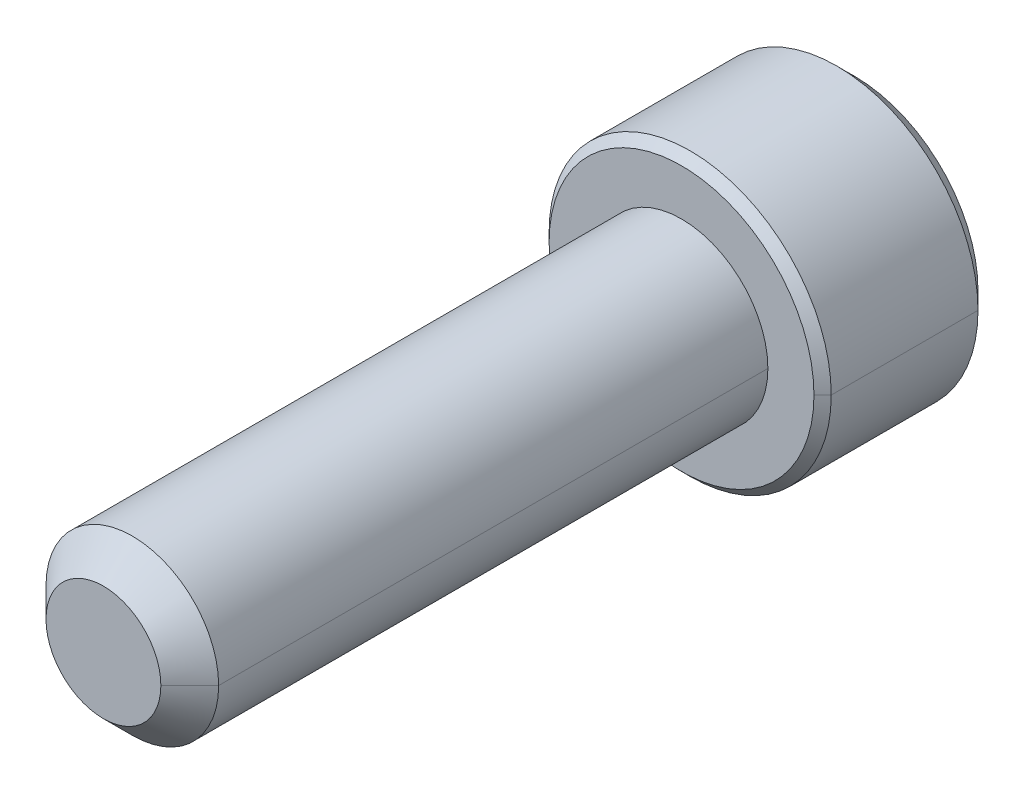
ISO-10303-21;
HEADER;
FILE_DESCRIPTION(('STEP AP214'),'2;1');
FILE_NAME('part.step','',(''),(''),'','','');
FILE_SCHEMA(('AUTOMOTIVE_DESIGN { 1 0 10303 214 1 1 1 1 }'));
ENDSEC;
DATA;
#1=APPLICATION_CONTEXT('core data for automotive mechanical design processes');
#2=APPLICATION_PROTOCOL_DEFINITION('international standard','automotive_design',2000,#1);
#3=PRODUCT_CONTEXT('',#1,'mechanical');
#4=PRODUCT('Part','Part','',(#3));
#5=PRODUCT_RELATED_PRODUCT_CATEGORY('part','',(#4));
#6=PRODUCT_DEFINITION_FORMATION('','',#4);
#7=PRODUCT_DEFINITION_CONTEXT('part definition',#1,'design');
#8=PRODUCT_DEFINITION('design','',#6,#7);
#9=PRODUCT_DEFINITION_SHAPE('','',#8);
#10=(LENGTH_UNIT() NAMED_UNIT(*) SI_UNIT(.MILLI.,.METRE.));
#11=(NAMED_UNIT(*) PLANE_ANGLE_UNIT() SI_UNIT($,.RADIAN.));
#12=(NAMED_UNIT(*) SI_UNIT($,.STERADIAN.) SOLID_ANGLE_UNIT());
#13=UNCERTAINTY_MEASURE_WITH_UNIT(LENGTH_MEASURE(1.E-05),#10,'distance_accuracy_value','');
#14=(GEOMETRIC_REPRESENTATION_CONTEXT(3) GLOBAL_UNCERTAINTY_ASSIGNED_CONTEXT((#13)) GLOBAL_UNIT_ASSIGNED_CONTEXT((#10,
#11,#12)) REPRESENTATION_CONTEXT('',''));
#15=CARTESIAN_POINT('',(0.,0.,0.));
#16=DIRECTION('',(0.,0.,1.));
#17=DIRECTION('',(1.,0.,0.));
#18=AXIS2_PLACEMENT_3D('',#15,#16,#17);
#19=CARTESIAN_POINT('',(0.,0.,-9.66724));
#20=DIRECTION('',(0.,0.,-1.));
#21=DIRECTION('',(-1.,0.,0.));
#22=AXIS2_PLACEMENT_3D('',#19,#20,#21);
#23=CONICAL_SURFACE('',#22,2.3241,0.785398163397447);
#24=CARTESIAN_POINT('',(0.,0.,-9.525));
#25=DIRECTION('',(0.,0.,1.));
#26=DIRECTION('',(-1.,0.,0.));
#27=AXIS2_PLACEMENT_3D('',#24,#25,#26);
#28=CIRCLE('',#27,2.18186);
#29=CARTESIAN_POINT('',(2.18186,0.,-9.525));
#30=VERTEX_POINT('',#29);
#31=CARTESIAN_POINT('',(-2.18186,0.,-9.525));
#32=VERTEX_POINT('',#31);
#33=EDGE_CURVE('E43',#30,#32,#28,.T.);
#34=ORIENTED_EDGE('',*,*,#33,.F.);
#35=DIRECTION('',(0.707106781186546,0.,-0.707106781186549));
#36=VECTOR('',#35,1.);
#37=CARTESIAN_POINT('',(2.3241,0.,-9.66724));
#38=LINE('',#37,#36);
#39=CARTESIAN_POINT('',(2.3241,0.,-9.66724));
#40=VERTEX_POINT('',#39);
#41=EDGE_CURVE('E11',#30,#40,#38,.T.);
#42=ORIENTED_EDGE('',*,*,#41,.T.);
#43=CARTESIAN_POINT('',(0.,0.,-9.66724));
#44=DIRECTION('',(0.,0.,-1.));
#45=DIRECTION('',(-1.,0.,0.));
#46=AXIS2_PLACEMENT_3D('',#43,#44,#45);
#47=CIRCLE('',#46,2.3241);
#48=CARTESIAN_POINT('',(-2.3241,0.,-9.66724));
#49=VERTEX_POINT('',#48);
#50=EDGE_CURVE('E554',#49,#40,#47,.T.);
#51=ORIENTED_EDGE('',*,*,#50,.F.);
#52=DIRECTION('',(-0.707106781186546,0.,-0.707106781186549));
#53=VECTOR('',#52,1.);
#54=CARTESIAN_POINT('',(-2.3241,0.,-9.66724));
#55=LINE('',#54,#53);
#56=EDGE_CURVE('E80',#32,#49,#55,.T.);
#57=ORIENTED_EDGE('',*,*,#56,.F.);
#58=EDGE_LOOP('',(#34,#42,#51,#57));
#59=FACE_BOUND('',#58,.T.);
#60=ADVANCED_FACE('F16',(#59),#23,.T.);
#61=CARTESIAN_POINT('',(0.,0.,-12.3698));
#62=DIRECTION('',(0.,0.,1.));
#63=DIRECTION('',(1.,0.,0.));
#64=AXIS2_PLACEMENT_3D('',#61,#62,#63);
#65=CONICAL_SURFACE('',#64,2.03962,0.785398163397448);
#66=CARTESIAN_POINT('',(0.,0.,-12.3698));
#67=DIRECTION('',(0.,0.,-1.));
#68=DIRECTION('',(-1.,0.,0.));
#69=AXIS2_PLACEMENT_3D('',#66,#67,#68);
#70=CIRCLE('',#69,2.03962);
#71=CARTESIAN_POINT('',(-2.03962,0.,-12.3698));
#72=VERTEX_POINT('',#71);
#73=CARTESIAN_POINT('',(2.03962,0.,-12.3698));
#74=VERTEX_POINT('',#73);
#75=EDGE_CURVE('E95',#72,#74,#70,.T.);
#76=ORIENTED_EDGE('',*,*,#75,.F.);
#77=DIRECTION('',(-0.707106781186547,0.,0.707106781186548));
#78=VECTOR('',#77,1.);
#79=CARTESIAN_POINT('',(-2.03962,0.,-12.3698));
#80=LINE('',#79,#78);
#81=CARTESIAN_POINT('',(-2.3241,0.,-12.08532));
#82=VERTEX_POINT('',#81);
#83=EDGE_CURVE('E29',#72,#82,#80,.T.);
#84=ORIENTED_EDGE('',*,*,#83,.T.);
#85=CARTESIAN_POINT('',(0.,0.,-12.08532));
#86=DIRECTION('',(0.,0.,1.));
#87=DIRECTION('',(-1.,0.,0.));
#88=AXIS2_PLACEMENT_3D('',#85,#86,#87);
#89=CIRCLE('',#88,2.3241);
#90=CARTESIAN_POINT('',(2.3241,0.,-12.08532));
#91=VERTEX_POINT('',#90);
#92=EDGE_CURVE('E197',#91,#82,#89,.T.);
#93=ORIENTED_EDGE('',*,*,#92,.F.);
#94=DIRECTION('',(0.707106781186547,0.,0.707106781186548));
#95=VECTOR('',#94,1.);
#96=CARTESIAN_POINT('',(2.03962,0.,-12.3698));
#97=LINE('',#96,#95);
#98=EDGE_CURVE('E570',#74,#91,#97,.T.);
#99=ORIENTED_EDGE('',*,*,#98,.F.);
#100=EDGE_LOOP('',(#76,#84,#93,#99));
#101=FACE_BOUND('',#100,.T.);
#102=ADVANCED_FACE('F413',(#101),#65,.T.);
#103=CARTESIAN_POINT('',(0.,0.,-12.3698));
#104=DIRECTION('',(0.,0.,-1.));
#105=DIRECTION('',(-1.,0.,0.));
#106=AXIS2_PLACEMENT_3D('',#103,#104,#105);
#107=CONICAL_SURFACE('',#106,1.3748153285078,0.78539816339745);
#108=CARTESIAN_POINT('',(-1.190625,0.,-12.1856096714922));
#109=CARTESIAN_POINT('',(-1.190625,0.172278178616055,-12.1856096714922));
#110=CARTESIAN_POINT('',(-1.190625,0.353926471092554,-12.2371005427235));
#111=CARTESIAN_POINT('',(-1.190625,0.511134708328644,-12.2816635220374));
#112=CARTESIAN_POINT('',(-1.190625,0.687407664253898,-12.3698));
#113=B_SPLINE_CURVE_WITH_KNOTS('',2,(#108,#109,#110,#111,#112),.UNSPECIFIED.,.F.,.F.,(3,2,3),
(0.,0.5,1.),.UNSPECIFIED.);
#114=CARTESIAN_POINT('',(-1.190625,0.,-12.1856096714922));
#115=VERTEX_POINT('',#114);
#116=CARTESIAN_POINT('',(-1.190625,0.687407664253898,-12.3698));
#117=VERTEX_POINT('',#116);
#118=EDGE_CURVE('E175',#115,#117,#113,.T.);
#119=ORIENTED_EDGE('',*,*,#118,.F.);
#120=DIRECTION('',(-0.707106781186549,0.,-0.707106781186546));
#121=VECTOR('',#120,1.);
#122=CARTESIAN_POINT('',(-1.3748153285078,0.,-12.3698));
#123=LINE('',#122,#121);
#124=CARTESIAN_POINT('',(-1.3748153285078,0.,-12.3698));
#125=VERTEX_POINT('',#124);
#126=EDGE_CURVE('E196',#115,#125,#123,.T.);
#127=ORIENTED_EDGE('',*,*,#126,.T.);
#128=CARTESIAN_POINT('',(0.,0.,-12.3698));
#129=DIRECTION('',(0.,0.,-1.));
#130=DIRECTION('',(-1.,0.,0.));
#131=AXIS2_PLACEMENT_3D('',#128,#129,#130);
#132=CIRCLE('',#131,1.3748153285078);
#133=EDGE_CURVE('E185',#125,#117,#132,.T.);
#134=ORIENTED_EDGE('',*,*,#133,.T.);
#135=EDGE_LOOP('',(#119,#127,#134));
#136=FACE_BOUND('',#135,.T.);
#137=ADVANCED_FACE('F199',(#136),#107,.F.);
#138=CARTESIAN_POINT('',(0.,0.,-12.3698));
#139=DIRECTION('',(0.,0.,1.));
#140=DIRECTION('',(1.,0.,0.));
#141=AXIS2_PLACEMENT_3D('',#138,#139,#140);
#142=CYLINDRICAL_SURFACE('',#141,2.3241);
#143=ORIENTED_EDGE('',*,*,#92,.T.);
#144=DIRECTION('',(0.,0.,1.));
#145=VECTOR('',#144,1.);
#146=CARTESIAN_POINT('',(-2.3241,0.,-12.3698));
#147=LINE('',#146,#145);
#148=EDGE_CURVE('E550',#82,#49,#147,.T.);
#149=ORIENTED_EDGE('',*,*,#148,.T.);
#150=ORIENTED_EDGE('',*,*,#50,.T.);
#151=DIRECTION('',(0.,0.,1.));
#152=VECTOR('',#151,1.);
#153=CARTESIAN_POINT('',(2.3241,0.,-12.3698));
#154=LINE('',#153,#152);
#155=EDGE_CURVE('E562',#91,#40,#154,.T.);
#156=ORIENTED_EDGE('',*,*,#155,.F.);
#157=EDGE_LOOP('',(#143,#149,#150,#156));
#158=FACE_BOUND('',#157,.T.);
#159=ADVANCED_FACE('F405',(#158),#142,.T.);
#160=CARTESIAN_POINT('',(0.,0.,0.));
#161=DIRECTION('',(0.,0.,-1.));
#162=DIRECTION('',(-1.,0.,0.));
#163=AXIS2_PLACEMENT_3D('',#160,#161,#162);
#164=CONICAL_SURFACE('',#163,0.94615,0.78539816339745);
#165=CARTESIAN_POINT('',(0.,0.,0.));
#166=DIRECTION('',(0.,0.,1.));
#167=DIRECTION('',(1.,0.,0.));
#168=AXIS2_PLACEMENT_3D('',#165,#166,#167);
#169=CIRCLE('',#168,0.94615);
#170=CARTESIAN_POINT('',(0.94615,0.,0.));
#171=VERTEX_POINT('',#170);
#172=CARTESIAN_POINT('',(-0.94615,0.,0.));
#173=VERTEX_POINT('',#172);
#174=EDGE_CURVE('E142',#171,#173,#169,.T.);
#175=ORIENTED_EDGE('',*,*,#174,.F.);
#176=DIRECTION('',(0.707106781186549,0.,-0.707106781186546));
#177=VECTOR('',#176,1.);
#178=CARTESIAN_POINT('',(0.94615,0.,0.));
#179=LINE('',#178,#177);
#180=CARTESIAN_POINT('',(1.4224,0.,-0.47625));
#181=VERTEX_POINT('',#180);
#182=EDGE_CURVE('E605',#171,#181,#179,.T.);
#183=ORIENTED_EDGE('',*,*,#182,.T.);
#184=CARTESIAN_POINT('',(0.,0.,-0.47625));
#185=DIRECTION('',(0.,0.,-1.));
#186=DIRECTION('',(1.,0.,0.));
#187=AXIS2_PLACEMENT_3D('',#184,#185,#186);
#188=CIRCLE('',#187,1.4224);
#189=CARTESIAN_POINT('',(-1.4224,0.,-0.47625));
#190=VERTEX_POINT('',#189);
#191=EDGE_CURVE('E597',#190,#181,#188,.T.);
#192=ORIENTED_EDGE('',*,*,#191,.F.);
#193=DIRECTION('',(-0.707106781186549,0.,-0.707106781186546));
#194=VECTOR('',#193,1.);
#195=CARTESIAN_POINT('',(-0.94615,0.,0.));
#196=LINE('',#195,#194);
#197=EDGE_CURVE('E555',#173,#190,#196,.T.);
#198=ORIENTED_EDGE('',*,*,#197,.F.);
#199=EDGE_LOOP('',(#175,#183,#192,#198));
#200=FACE_BOUND('',#199,.T.);
#201=ADVANCED_FACE('F403',(#200),#164,.T.);
#202=CARTESIAN_POINT('',(0.,0.,-9.525));
#203=DIRECTION('',(0.,0.,1.));
#204=DIRECTION('',(1.,0.,0.));
#205=AXIS2_PLACEMENT_3D('',#202,#203,#204);
#206=CYLINDRICAL_SURFACE('',#205,1.4224);
#207=CARTESIAN_POINT('',(0.,0.,-9.525));
#208=DIRECTION('',(0.,0.,1.));
#209=DIRECTION('',(-1.,0.,0.));
#210=AXIS2_PLACEMENT_3D('',#207,#208,#209);
#211=CIRCLE('',#210,1.4224);
#212=CARTESIAN_POINT('',(1.4224,0.,-9.525));
#213=VERTEX_POINT('',#212);
#214=CARTESIAN_POINT('',(-1.4224,0.,-9.525));
#215=VERTEX_POINT('',#214);
#216=EDGE_CURVE('E602',#213,#215,#211,.T.);
#217=ORIENTED_EDGE('',*,*,#216,.T.);
#218=DIRECTION('',(0.,0.,1.));
#219=VECTOR('',#218,1.);
#220=CARTESIAN_POINT('',(-1.4224,0.,-9.525));
#221=LINE('',#220,#219);
#222=EDGE_CURVE('E594',#215,#190,#221,.T.);
#223=ORIENTED_EDGE('',*,*,#222,.T.);
#224=ORIENTED_EDGE('',*,*,#191,.T.);
#225=DIRECTION('',(0.,0.,1.));
#226=VECTOR('',#225,1.);
#227=CARTESIAN_POINT('',(1.4224,0.,-9.525));
#228=LINE('',#227,#226);
#229=EDGE_CURVE('E155',#213,#181,#228,.T.);
#230=ORIENTED_EDGE('',*,*,#229,.F.);
#231=EDGE_LOOP('',(#217,#223,#224,#230));
#232=FACE_BOUND('',#231,.T.);
#233=ADVANCED_FACE('F316',(#232),#206,.T.);
#234=CARTESIAN_POINT('',(0.,0.,-9.525));
#235=DIRECTION('',(0.,0.,1.));
#236=DIRECTION('',(1.,0.,0.));
#237=AXIS2_PLACEMENT_3D('',#234,#235,#236);
#238=CYLINDRICAL_SURFACE('',#237,1.4224);
#239=ORIENTED_EDGE('',*,*,#222,.F.);
#240=CARTESIAN_POINT('',(0.,0.,-9.525));
#241=DIRECTION('',(0.,0.,1.));
#242=DIRECTION('',(-1.,0.,0.));
#243=AXIS2_PLACEMENT_3D('',#240,#241,#242);
#244=CIRCLE('',#243,1.4224);
#245=EDGE_CURVE('E584',#215,#213,#244,.T.);
#246=ORIENTED_EDGE('',*,*,#245,.T.);
#247=ORIENTED_EDGE('',*,*,#229,.T.);
#248=CARTESIAN_POINT('',(0.,0.,-0.47625));
#249=DIRECTION('',(0.,0.,-1.));
#250=DIRECTION('',(1.,0.,0.));
#251=AXIS2_PLACEMENT_3D('',#248,#249,#250);
#252=CIRCLE('',#251,1.4224);
#253=EDGE_CURVE('E577',#181,#190,#252,.T.);
#254=ORIENTED_EDGE('',*,*,#253,.T.);
#255=EDGE_LOOP('',(#239,#246,#247,#254));
#256=FACE_BOUND('',#255,.T.);
#257=ADVANCED_FACE('F307',(#256),#238,.T.);
#258=CARTESIAN_POINT('',(0.,0.,0.));
#259=DIRECTION('',(0.,0.,1.));
#260=DIRECTION('',(1.,0.,0.));
#261=AXIS2_PLACEMENT_3D('',#258,#259,#260);
#262=PLANE('',#261);
#263=CARTESIAN_POINT('',(0.,0.,0.));
#264=DIRECTION('',(0.,0.,1.));
#265=DIRECTION('',(1.,0.,0.));
#266=AXIS2_PLACEMENT_3D('',#263,#264,#265);
#267=CIRCLE('',#266,0.94615);
#268=EDGE_CURVE('E576',#173,#171,#267,.T.);
#269=ORIENTED_EDGE('',*,*,#268,.T.);
#270=ORIENTED_EDGE('',*,*,#174,.T.);
#271=EDGE_LOOP('',(#269,#270));
#272=FACE_BOUND('',#271,.T.);
#273=ADVANCED_FACE('F303',(#272),#262,.T.);
#274=CARTESIAN_POINT('',(0.,0.,0.));
#275=DIRECTION('',(0.,0.,-1.));
#276=DIRECTION('',(-1.,0.,0.));
#277=AXIS2_PLACEMENT_3D('',#274,#275,#276);
#278=CONICAL_SURFACE('',#277,0.94615,0.78539816339745);
#279=ORIENTED_EDGE('',*,*,#182,.F.);
#280=ORIENTED_EDGE('',*,*,#268,.F.);
#281=ORIENTED_EDGE('',*,*,#197,.T.);
#282=ORIENTED_EDGE('',*,*,#253,.F.);
#283=EDGE_LOOP('',(#279,#280,#281,#282));
#284=FACE_BOUND('',#283,.T.);
#285=ADVANCED_FACE('F306',(#284),#278,.T.);
#286=CARTESIAN_POINT('',(0.,0.,-12.3698));
#287=DIRECTION('',(0.,0.,1.));
#288=DIRECTION('',(1.,0.,0.));
#289=AXIS2_PLACEMENT_3D('',#286,#287,#288);
#290=CYLINDRICAL_SURFACE('',#289,2.3241);
#291=ORIENTED_EDGE('',*,*,#148,.F.);
#292=CARTESIAN_POINT('',(0.,0.,-12.08532));
#293=DIRECTION('',(0.,0.,1.));
#294=DIRECTION('',(-1.,0.,0.));
#295=AXIS2_PLACEMENT_3D('',#292,#293,#294);
#296=CIRCLE('',#295,2.3241);
#297=EDGE_CURVE('E558',#82,#91,#296,.T.);
#298=ORIENTED_EDGE('',*,*,#297,.T.);
#299=ORIENTED_EDGE('',*,*,#155,.T.);
#300=CARTESIAN_POINT('',(0.,0.,-9.66724));
#301=DIRECTION('',(0.,0.,-1.));
#302=DIRECTION('',(-1.,0.,0.));
#303=AXIS2_PLACEMENT_3D('',#300,#301,#302);
#304=CIRCLE('',#303,2.3241);
#305=EDGE_CURVE('E548',#40,#49,#304,.T.);
#306=ORIENTED_EDGE('',*,*,#305,.T.);
#307=EDGE_LOOP('',(#291,#298,#299,#306));
#308=FACE_BOUND('',#307,.T.);
#309=ADVANCED_FACE('F312',(#308),#290,.T.);
#310=CARTESIAN_POINT('',(0.,0.,-12.3698));
#311=DIRECTION('',(0.,0.,-1.));
#312=DIRECTION('',(0.,-1.,0.));
#313=AXIS2_PLACEMENT_3D('',#310,#311,#312);
#314=PLANE('',#313);
#315=CARTESIAN_POINT('',(0.,0.,-12.3698));
#316=DIRECTION('',(0.,0.,-1.));
#317=DIRECTION('',(-1.,0.,0.));
#318=AXIS2_PLACEMENT_3D('',#315,#316,#317);
#319=CIRCLE('',#318,2.03962);
#320=EDGE_CURVE('E571',#74,#72,#319,.T.);
#321=ORIENTED_EDGE('',*,*,#320,.T.);
#322=ORIENTED_EDGE('',*,*,#75,.T.);
#323=EDGE_LOOP('',(#321,#322));
#324=FACE_BOUND('',#323,.T.);
#325=CARTESIAN_POINT('',(0.,0.,-12.3698));
#326=DIRECTION('',(0.,0.,-1.));
#327=DIRECTION('',(-1.,0.,0.));
#328=AXIS2_PLACEMENT_3D('',#325,#326,#327);
#329=CIRCLE('',#328,1.3748153285078);
#330=CARTESIAN_POINT('',(0.,1.3748153285078,-12.3698));
#331=VERTEX_POINT('',#330);
#332=EDGE_CURVE('E193',#117,#331,#329,.T.);
#333=ORIENTED_EDGE('',*,*,#332,.F.);
#334=ORIENTED_EDGE('',*,*,#133,.F.);
#335=CARTESIAN_POINT('',(0.,0.,-12.3698));
#336=DIRECTION('',(0.,0.,-1.));
#337=DIRECTION('',(-1.,0.,0.));
#338=AXIS2_PLACEMENT_3D('',#335,#336,#337);
#339=CIRCLE('',#338,1.3748153285078);
#340=CARTESIAN_POINT('',(-1.190625,-0.687407664253898,-12.3698));
#341=VERTEX_POINT('',#340);
#342=EDGE_CURVE('E189',#341,#125,#339,.T.);
#343=ORIENTED_EDGE('',*,*,#342,.F.);
#344=CARTESIAN_POINT('',(0.,0.,-12.3698));
#345=DIRECTION('',(0.,0.,-1.));
#346=DIRECTION('',(-1.,0.,0.));
#347=AXIS2_PLACEMENT_3D('',#344,#345,#346);
#348=CIRCLE('',#347,1.3748153285078);
#349=CARTESIAN_POINT('',(0.,-1.3748153285078,-12.3698));
#350=VERTEX_POINT('',#349);
#351=EDGE_CURVE('E209',#350,#341,#348,.T.);
#352=ORIENTED_EDGE('',*,*,#351,.F.);
#353=CARTESIAN_POINT('',(0.,0.,-12.3698));
#354=DIRECTION('',(0.,0.,-1.));
#355=DIRECTION('',(-1.,0.,0.));
#356=AXIS2_PLACEMENT_3D('',#353,#354,#355);
#357=CIRCLE('',#356,1.3748153285078);
#358=CARTESIAN_POINT('',(1.190625,-0.687407664253898,-12.3698));
#359=VERTEX_POINT('',#358);
#360=EDGE_CURVE('E216',#359,#350,#357,.T.);
#361=ORIENTED_EDGE('',*,*,#360,.F.);
#362=CARTESIAN_POINT('',(0.,0.,-12.3698));
#363=DIRECTION('',(0.,0.,-1.));
#364=DIRECTION('',(-1.,0.,0.));
#365=AXIS2_PLACEMENT_3D('',#362,#363,#364);
#366=CIRCLE('',#365,1.3748153285078);
#367=CARTESIAN_POINT('',(1.190625,0.687407664253899,-12.3698));
#368=VERTEX_POINT('',#367);
#369=EDGE_CURVE('E471',#368,#359,#366,.T.);
#370=ORIENTED_EDGE('',*,*,#369,.F.);
#371=CARTESIAN_POINT('',(0.,0.,-12.3698));
#372=DIRECTION('',(0.,0.,-1.));
#373=DIRECTION('',(-1.,0.,0.));
#374=AXIS2_PLACEMENT_3D('',#371,#372,#373);
#375=CIRCLE('',#374,1.3748153285078);
#376=EDGE_CURVE('E468',#331,#368,#375,.T.);
#377=ORIENTED_EDGE('',*,*,#376,.F.);
#378=EDGE_LOOP('',(#333,#334,#343,#352,#361,#370,#377));
#379=FACE_BOUND('',#378,.T.);
#380=ADVANCED_FACE('F186',(#324,#379),#314,.T.);
#381=CARTESIAN_POINT('',(0.,0.,-9.525));
#382=DIRECTION('',(0.,0.,-1.));
#383=DIRECTION('',(0.,-1.,0.));
#384=AXIS2_PLACEMENT_3D('',#381,#382,#383);
#385=PLANE('',#384);
#386=CARTESIAN_POINT('',(0.,0.,-9.525));
#387=DIRECTION('',(0.,0.,1.));
#388=DIRECTION('',(-1.,0.,0.));
#389=AXIS2_PLACEMENT_3D('',#386,#387,#388);
#390=CIRCLE('',#389,2.18186);
#391=EDGE_CURVE('E563',#32,#30,#390,.T.);
#392=ORIENTED_EDGE('',*,*,#391,.T.);
#393=ORIENTED_EDGE('',*,*,#33,.T.);
#394=EDGE_LOOP('',(#392,#393));
#395=FACE_BOUND('',#394,.T.);
#396=ORIENTED_EDGE('',*,*,#216,.F.);
#397=ORIENTED_EDGE('',*,*,#245,.F.);
#398=EDGE_LOOP('',(#396,#397));
#399=FACE_BOUND('',#398,.T.);
#400=ADVANCED_FACE('F311',(#395,#399),#385,.F.);
#401=CARTESIAN_POINT('',(0.,0.,-12.3698));
#402=DIRECTION('',(0.,0.,-1.));
#403=DIRECTION('',(-1.,0.,0.));
#404=AXIS2_PLACEMENT_3D('',#401,#402,#403);
#405=CONICAL_SURFACE('',#404,1.3748153285078,0.78539816339745);
#406=ORIENTED_EDGE('',*,*,#376,.T.);
#407=CARTESIAN_POINT('',(0.,1.3748153285078,-12.3698));
#408=CARTESIAN_POINT('',(0.317600885196483,1.19144837194474,-12.1864330434369));
#409=CARTESIAN_POINT('',(0.593119038485548,1.03237789197667,-12.1856123654655));
#410=CARTESIAN_POINT('',(0.870173277928649,0.872420552254072,-12.1847871119985));
#411=CARTESIAN_POINT('',(1.190625,0.687407664253898,-12.3698));
#412=B_SPLINE_CURVE_WITH_KNOTS('',2,(#407,#408,#409,#410,#411),.UNSPECIFIED.,.F.,.F.,(3,2,3),
(0.,0.5,1.),.UNSPECIFIED.);
#413=EDGE_CURVE('E457',#331,#368,#412,.T.);
#414=ORIENTED_EDGE('',*,*,#413,.F.);
#415=EDGE_LOOP('',(#406,#414));
#416=FACE_BOUND('',#415,.T.);
#417=ADVANCED_FACE('F253',(#416),#405,.F.);
#418=CARTESIAN_POINT('',(0.,0.,-12.3698));
#419=DIRECTION('',(0.,0.,-1.));
#420=DIRECTION('',(-1.,0.,0.));
#421=AXIS2_PLACEMENT_3D('',#418,#419,#420);
#422=CONICAL_SURFACE('',#421,1.3748153285078,0.78539816339745);
#423=ORIENTED_EDGE('',*,*,#369,.T.);
#424=CARTESIAN_POINT('',(1.190625,0.687407664253898,-12.3698));
#425=CARTESIAN_POINT('',(1.190625,0.319414746746739,-12.1858035412464));
#426=CARTESIAN_POINT('',(1.190625,0.000186367613154762,-12.1856096860782));
#427=CARTESIAN_POINT('',(1.190625,-0.318639814551512,-12.1854160751488));
#428=CARTESIAN_POINT('',(1.190625,-0.687407664253898,-12.3698));
#429=B_SPLINE_CURVE_WITH_KNOTS('',2,(#424,#425,#426,#427,#428),.UNSPECIFIED.,.F.,.F.,(3,2,3),
(0.,0.5,1.),.UNSPECIFIED.);
#430=EDGE_CURVE('E341',#368,#359,#429,.T.);
#431=ORIENTED_EDGE('',*,*,#430,.F.);
#432=EDGE_LOOP('',(#423,#431));
#433=FACE_BOUND('',#432,.T.);
#434=ADVANCED_FACE('F348',(#433),#422,.F.);
#435=CARTESIAN_POINT('',(0.,0.,-12.3698));
#436=DIRECTION('',(0.,0.,-1.));
#437=DIRECTION('',(-1.,0.,0.));
#438=AXIS2_PLACEMENT_3D('',#435,#436,#437);
#439=CONICAL_SURFACE('',#438,1.3748153285078,0.78539816339745);
#440=ORIENTED_EDGE('',*,*,#360,.T.);
#441=CARTESIAN_POINT('',(1.190625,-0.687407664253898,-12.3698));
#442=CARTESIAN_POINT('',(0.873024114801661,-0.870774620818022,-12.1864330434359));
#443=CARTESIAN_POINT('',(0.597505961514452,-1.02984510078502,-12.1856123654655));
#444=CARTESIAN_POINT('',(0.320451722069476,-1.18980244050871,-12.1847871119996));
#445=CARTESIAN_POINT('',(0.,-1.3748153285078,-12.3698));
#446=B_SPLINE_CURVE_WITH_KNOTS('',2,(#441,#442,#443,#444,#445),.UNSPECIFIED.,.F.,.F.,(3,2,3),
(0.,0.5,1.),.UNSPECIFIED.);
#447=EDGE_CURVE('E379',#359,#350,#446,.T.);
#448=ORIENTED_EDGE('',*,*,#447,.F.);
#449=EDGE_LOOP('',(#440,#448));
#450=FACE_BOUND('',#449,.T.);
#451=ADVANCED_FACE('F357',(#450),#439,.F.);
#452=CARTESIAN_POINT('',(0.,0.,-12.3698));
#453=DIRECTION('',(0.,0.,-1.));
#454=DIRECTION('',(-1.,0.,0.));
#455=AXIS2_PLACEMENT_3D('',#452,#453,#454);
#456=CONICAL_SURFACE('',#455,1.3748153285078,0.78539816339745);
#457=ORIENTED_EDGE('',*,*,#351,.T.);
#458=CARTESIAN_POINT('',(0.,-1.3748153285078,-12.3698));
#459=CARTESIAN_POINT('',(-0.317600885197414,-1.19144837194421,-12.1864330434364));
#460=CARTESIAN_POINT('',(-0.593119038485548,-1.03237789197667,-12.1856123654655));
#461=CARTESIAN_POINT('',(-0.870173277929577,-0.872420552253536,-12.1847871119991));
#462=CARTESIAN_POINT('',(-1.190625,-0.687407664253898,-12.3698));
#463=B_SPLINE_CURVE_WITH_KNOTS('',2,(#458,#459,#460,#461,#462),.UNSPECIFIED.,.F.,.F.,(3,2,3),
(0.,0.5,1.),.UNSPECIFIED.);
#464=EDGE_CURVE('E232',#350,#341,#463,.T.);
#465=ORIENTED_EDGE('',*,*,#464,.F.);
#466=EDGE_LOOP('',(#457,#465));
#467=FACE_BOUND('',#466,.T.);
#468=ADVANCED_FACE('F301',(#467),#456,.F.);
#469=CARTESIAN_POINT('',(0.,0.,-12.3698));
#470=DIRECTION('',(0.,0.,-1.));
#471=DIRECTION('',(-1.,0.,0.));
#472=AXIS2_PLACEMENT_3D('',#469,#470,#471);
#473=CONICAL_SURFACE('',#472,1.3748153285078,0.78539816339745);
#474=ORIENTED_EDGE('',*,*,#126,.F.);
#475=CARTESIAN_POINT('',(-1.190625,-0.687407664253898,-12.3698));
#476=CARTESIAN_POINT('',(-1.190625,-0.319027007238298,-12.1856096714922));
#477=CARTESIAN_POINT('',(-1.190625,0.,-12.1856096714922));
#478=B_SPLINE_CURVE_WITH_KNOTS('',2,(#475,#476,#477),.UNSPECIFIED.,.F.,.F.,(3,3),(0.,1.),.UNSPECIFIED.);
#479=EDGE_CURVE('E205',#341,#115,#478,.T.);
#480=ORIENTED_EDGE('',*,*,#479,.F.);
#481=ORIENTED_EDGE('',*,*,#342,.T.);
#482=EDGE_LOOP('',(#474,#480,#481));
#483=FACE_BOUND('',#482,.T.);
#484=ADVANCED_FACE('F204',(#483),#473,.F.);
#485=CARTESIAN_POINT('',(0.,0.,-12.3698));
#486=DIRECTION('',(0.,0.,-1.));
#487=DIRECTION('',(-1.,0.,0.));
#488=AXIS2_PLACEMENT_3D('',#485,#486,#487);
#489=CONICAL_SURFACE('',#488,1.3748153285078,0.78539816339745);
#490=ORIENTED_EDGE('',*,*,#332,.T.);
#491=CARTESIAN_POINT('',(-1.190625,0.687407664253898,-12.3698));
#492=CARTESIAN_POINT('',(-0.873024114801661,0.870774620818022,-12.1864330434359));
#493=CARTESIAN_POINT('',(-0.597505961514452,1.02984510078502,-12.1856123654655));
#494=CARTESIAN_POINT('',(-0.320451722069476,1.18980244050871,-12.1847871119996));
#495=CARTESIAN_POINT('',(0.,1.3748153285078,-12.3698));
#496=B_SPLINE_CURVE_WITH_KNOTS('',2,(#491,#492,#493,#494,#495),.UNSPECIFIED.,.F.,.F.,(3,2,3),
(0.,0.5,1.),.UNSPECIFIED.);
#497=EDGE_CURVE('E282',#117,#331,#496,.T.);
#498=ORIENTED_EDGE('',*,*,#497,.F.);
#499=EDGE_LOOP('',(#490,#498));
#500=FACE_BOUND('',#499,.T.);
#501=ADVANCED_FACE('F422',(#500),#489,.F.);
#502=CARTESIAN_POINT('',(1.190625,2.0622229927617,-10.5838625));
#503=DIRECTION('',(0.,0.,-1.));
#504=DIRECTION('',(0.,-1.,0.));
#505=AXIS2_PLACEMENT_3D('',#502,#503,#504);
#506=PLANE('',#505);
#507=DIRECTION('',(0.866025403784439,0.5,0.));
#508=VECTOR('',#507,1.);
#509=CARTESIAN_POINT('',(-1.190625,0.687407664253898,-10.5838625));
#510=LINE('',#509,#508);
#511=CARTESIAN_POINT('',(-1.190625,0.687407664253898,-10.5838625));
#512=VERTEX_POINT('',#511);
#513=CARTESIAN_POINT('',(0.,1.3748153285078,-10.5838625));
#514=VERTEX_POINT('',#513);
#515=EDGE_CURVE('E219',#512,#514,#510,.T.);
#516=ORIENTED_EDGE('',*,*,#515,.T.);
#517=DIRECTION('',(0.866025403784439,-0.5,0.));
#518=VECTOR('',#517,1.);
#519=CARTESIAN_POINT('',(0.,1.3748153285078,-10.5838625));
#520=LINE('',#519,#518);
#521=CARTESIAN_POINT('',(1.190625,0.687407664253898,-10.5838625));
#522=VERTEX_POINT('',#521);
#523=EDGE_CURVE('E544',#514,#522,#520,.T.);
#524=ORIENTED_EDGE('',*,*,#523,.T.);
#525=DIRECTION('',(0.,-1.,0.));
#526=VECTOR('',#525,1.);
#527=CARTESIAN_POINT('',(1.190625,0.687407664253898,-10.5838625));
#528=LINE('',#527,#526);
#529=CARTESIAN_POINT('',(1.190625,-0.687407664253898,-10.5838625));
#530=VERTEX_POINT('',#529);
#531=EDGE_CURVE('E538',#522,#530,#528,.T.);
#532=ORIENTED_EDGE('',*,*,#531,.T.);
#533=DIRECTION('',(-0.866025403784439,-0.5,0.));
#534=VECTOR('',#533,1.);
#535=CARTESIAN_POINT('',(1.190625,-0.687407664253898,-10.5838625));
#536=LINE('',#535,#534);
#537=CARTESIAN_POINT('',(0.,-1.3748153285078,-10.5838625));
#538=VERTEX_POINT('',#537);
#539=EDGE_CURVE('E533',#530,#538,#536,.T.);
#540=ORIENTED_EDGE('',*,*,#539,.T.);
#541=DIRECTION('',(-0.866025403784439,0.5,0.));
#542=VECTOR('',#541,1.);
#543=CARTESIAN_POINT('',(0.,-1.3748153285078,-10.5838625));
#544=LINE('',#543,#542);
#545=CARTESIAN_POINT('',(-1.190625,-0.687407664253898,-10.5838625));
#546=VERTEX_POINT('',#545);
#547=EDGE_CURVE('E530',#538,#546,#544,.T.);
#548=ORIENTED_EDGE('',*,*,#547,.T.);
#549=DIRECTION('',(0.,1.,0.));
#550=VECTOR('',#549,1.);
#551=CARTESIAN_POINT('',(-1.190625,-0.687407664253898,-10.5838625));
#552=LINE('',#551,#550);
#553=EDGE_CURVE('E478',#546,#512,#552,.T.);
#554=ORIENTED_EDGE('',*,*,#553,.T.);
#555=EDGE_LOOP('',(#516,#524,#532,#540,#548,#554));
#556=FACE_BOUND('',#555,.T.);
#557=ADVANCED_FACE('F421',(#556),#506,.T.);
#558=CARTESIAN_POINT('',(0.,1.3748153285078,-10.5838625));
#559=DIRECTION('',(0.5,0.866025403784439,0.));
#560=DIRECTION('',(0.,0.,-1.));
#561=AXIS2_PLACEMENT_3D('',#558,#559,#560);
#562=PLANE('',#561);
#563=DIRECTION('',(0.,0.,-1.));
#564=VECTOR('',#563,1.);
#565=CARTESIAN_POINT('',(0.,1.3748153285078,-10.5838625));
#566=LINE('',#565,#564);
#567=EDGE_CURVE('E474',#514,#331,#566,.T.);
#568=ORIENTED_EDGE('',*,*,#567,.T.);
#569=ORIENTED_EDGE('',*,*,#413,.T.);
#570=DIRECTION('',(0.,0.,-1.));
#571=VECTOR('',#570,1.);
#572=CARTESIAN_POINT('',(1.190625,0.687407664253898,-10.5838625));
#573=LINE('',#572,#571);
#574=EDGE_CURVE('E485',#522,#368,#573,.T.);
#575=ORIENTED_EDGE('',*,*,#574,.F.);
#576=ORIENTED_EDGE('',*,*,#523,.F.);
#577=EDGE_LOOP('',(#568,#569,#575,#576));
#578=FACE_BOUND('',#577,.T.);
#579=ADVANCED_FACE('F322',(#578),#562,.F.);
#580=CARTESIAN_POINT('',(1.190625,0.687407664253898,-10.5838625));
#581=DIRECTION('',(1.,0.,0.));
#582=DIRECTION('',(0.,1.,0.));
#583=AXIS2_PLACEMENT_3D('',#580,#581,#582);
#584=PLANE('',#583);
#585=ORIENTED_EDGE('',*,*,#574,.T.);
#586=ORIENTED_EDGE('',*,*,#430,.T.);
#587=DIRECTION('',(0.,0.,-1.));
#588=VECTOR('',#587,1.);
#589=CARTESIAN_POINT('',(1.190625,-0.687407664253898,-10.5838625));
#590=LINE('',#589,#588);
#591=EDGE_CURVE('E496',#530,#359,#590,.T.);
#592=ORIENTED_EDGE('',*,*,#591,.F.);
#593=ORIENTED_EDGE('',*,*,#531,.F.);
#594=EDGE_LOOP('',(#585,#586,#592,#593));
#595=FACE_BOUND('',#594,.T.);
#596=ADVANCED_FACE('F317',(#595),#584,.F.);
#597=CARTESIAN_POINT('',(1.190625,-0.687407664253898,-10.5838625));
#598=DIRECTION('',(0.5,-0.866025403784439,0.));
#599=DIRECTION('',(0.,0.,-1.));
#600=AXIS2_PLACEMENT_3D('',#597,#598,#599);
#601=PLANE('',#600);
#602=ORIENTED_EDGE('',*,*,#591,.T.);
#603=ORIENTED_EDGE('',*,*,#447,.T.);
#604=DIRECTION('',(0.,0.,-1.));
#605=VECTOR('',#604,1.);
#606=CARTESIAN_POINT('',(0.,-1.3748153285078,-10.5838625));
#607=LINE('',#606,#605);
#608=EDGE_CURVE('E375',#538,#350,#607,.T.);
#609=ORIENTED_EDGE('',*,*,#608,.F.);
#610=ORIENTED_EDGE('',*,*,#539,.F.);
#611=EDGE_LOOP('',(#602,#603,#609,#610));
#612=FACE_BOUND('',#611,.T.);
#613=ADVANCED_FACE('F321',(#612),#601,.F.);
#614=CARTESIAN_POINT('',(0.,-1.3748153285078,-10.5838625));
#615=DIRECTION('',(-0.5,-0.866025403784439,0.));
#616=DIRECTION('',(-0.866025403784439,0.5,0.));
#617=AXIS2_PLACEMENT_3D('',#614,#615,#616);
#618=PLANE('',#617);
#619=ORIENTED_EDGE('',*,*,#608,.T.);
#620=ORIENTED_EDGE('',*,*,#464,.T.);
#621=DIRECTION('',(0.,0.,-1.));
#622=VECTOR('',#621,1.);
#623=CARTESIAN_POINT('',(-1.190625,-0.687407664253898,-10.5838625));
#624=LINE('',#623,#622);
#625=EDGE_CURVE('E229',#546,#341,#624,.T.);
#626=ORIENTED_EDGE('',*,*,#625,.F.);
#627=ORIENTED_EDGE('',*,*,#547,.F.);
#628=EDGE_LOOP('',(#619,#620,#626,#627));
#629=FACE_BOUND('',#628,.T.);
#630=ADVANCED_FACE('F252',(#629),#618,.F.);
#631=CARTESIAN_POINT('',(-1.190625,-0.687407664253898,-10.5838625));
#632=DIRECTION('',(-1.,0.,0.));
#633=DIRECTION('',(0.,0.,1.));
#634=AXIS2_PLACEMENT_3D('',#631,#632,#633);
#635=PLANE('',#634);
#636=ORIENTED_EDGE('',*,*,#625,.T.);
#637=ORIENTED_EDGE('',*,*,#479,.T.);
#638=ORIENTED_EDGE('',*,*,#118,.T.);
#639=DIRECTION('',(0.,0.,-1.));
#640=VECTOR('',#639,1.);
#641=CARTESIAN_POINT('',(-1.190625,0.687407664253898,-10.5838625));
#642=LINE('',#641,#640);
#643=EDGE_CURVE('E280',#512,#117,#642,.T.);
#644=ORIENTED_EDGE('',*,*,#643,.F.);
#645=ORIENTED_EDGE('',*,*,#553,.F.);
#646=EDGE_LOOP('',(#636,#637,#638,#644,#645));
#647=FACE_BOUND('',#646,.T.);
#648=ADVANCED_FACE('F241',(#647),#635,.F.);
#649=CARTESIAN_POINT('',(-1.190625,0.687407664253898,-10.5838625));
#650=DIRECTION('',(-0.5,0.866025403784439,0.));
#651=DIRECTION('',(0.,0.,1.));
#652=AXIS2_PLACEMENT_3D('',#649,#650,#651);
#653=PLANE('',#652);
#654=ORIENTED_EDGE('',*,*,#643,.T.);
#655=ORIENTED_EDGE('',*,*,#497,.T.);
#656=ORIENTED_EDGE('',*,*,#567,.F.);
#657=ORIENTED_EDGE('',*,*,#515,.F.);
#658=EDGE_LOOP('',(#654,#655,#656,#657));
#659=FACE_BOUND('',#658,.T.);
#660=ADVANCED_FACE('F251',(#659),#653,.F.);
#661=CARTESIAN_POINT('',(0.,0.,-12.3698));
#662=DIRECTION('',(0.,0.,1.));
#663=DIRECTION('',(1.,0.,0.));
#664=AXIS2_PLACEMENT_3D('',#661,#662,#663);
#665=CONICAL_SURFACE('',#664,2.03962,0.785398163397448);
#666=ORIENTED_EDGE('',*,*,#83,.F.);
#667=ORIENTED_EDGE('',*,*,#320,.F.);
#668=ORIENTED_EDGE('',*,*,#98,.T.);
#669=ORIENTED_EDGE('',*,*,#297,.F.);
#670=EDGE_LOOP('',(#666,#667,#668,#669));
#671=FACE_BOUND('',#670,.T.);
#672=ADVANCED_FACE('F300',(#671),#665,.T.);
#673=CARTESIAN_POINT('',(0.,0.,-9.66724));
#674=DIRECTION('',(0.,0.,-1.));
#675=DIRECTION('',(-1.,0.,0.));
#676=AXIS2_PLACEMENT_3D('',#673,#674,#675);
#677=CONICAL_SURFACE('',#676,2.3241,0.785398163397447);
#678=ORIENTED_EDGE('',*,*,#41,.F.);
#679=ORIENTED_EDGE('',*,*,#391,.F.);
#680=ORIENTED_EDGE('',*,*,#56,.T.);
#681=ORIENTED_EDGE('',*,*,#305,.F.);
#682=EDGE_LOOP('',(#678,#679,#680,#681));
#683=FACE_BOUND('',#682,.T.);
#684=ADVANCED_FACE('F18',(#683),#677,.T.);
#685=CLOSED_SHELL('',(#60,#102,#137,#159,#201,#233,#257,#273,#285,#309,#380,#400,#417,#434,#451,
#468,#484,#501,#557,#579,#596,#613,#630,#648,#660,#672,#684));
#686=MANIFOLD_SOLID_BREP('B1',#685);
#687=ADVANCED_BREP_SHAPE_REPRESENTATION('',(#18,#686),#14);
#688=SHAPE_DEFINITION_REPRESENTATION(#9,#687);
ENDSEC;
END-ISO-10303-21;
